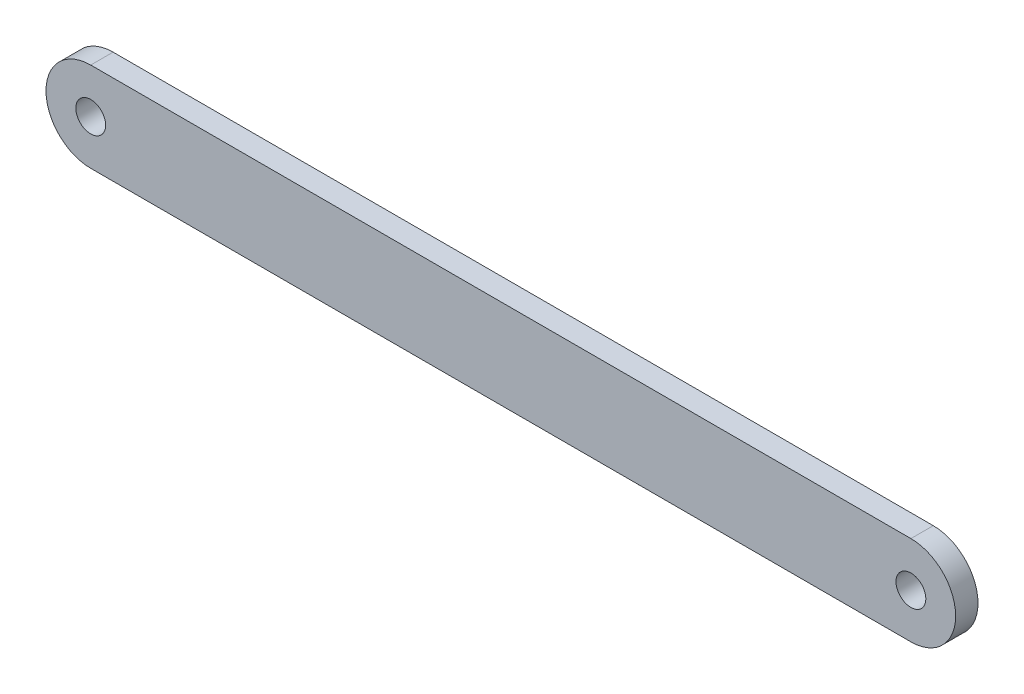
ISO-10303-21;
HEADER;
FILE_DESCRIPTION(('STEP AP214'),'2;1');
FILE_NAME('part.step','',(''),(''),'','','');
FILE_SCHEMA(('AUTOMOTIVE_DESIGN { 1 0 10303 214 1 1 1 1 }'));
ENDSEC;
DATA;
#1=APPLICATION_CONTEXT('core data for automotive mechanical design processes');
#2=APPLICATION_PROTOCOL_DEFINITION('international standard','automotive_design',2000,#1);
#3=PRODUCT_CONTEXT('',#1,'mechanical');
#4=PRODUCT('Part','Part','',(#3));
#5=PRODUCT_RELATED_PRODUCT_CATEGORY('part','',(#4));
#6=PRODUCT_DEFINITION_FORMATION('','',#4);
#7=PRODUCT_DEFINITION_CONTEXT('part definition',#1,'design');
#8=PRODUCT_DEFINITION('design','',#6,#7);
#9=PRODUCT_DEFINITION_SHAPE('','',#8);
#10=(LENGTH_UNIT() NAMED_UNIT(*) SI_UNIT(.MILLI.,.METRE.));
#11=(NAMED_UNIT(*) PLANE_ANGLE_UNIT() SI_UNIT($,.RADIAN.));
#12=(NAMED_UNIT(*) SI_UNIT($,.STERADIAN.) SOLID_ANGLE_UNIT());
#13=UNCERTAINTY_MEASURE_WITH_UNIT(LENGTH_MEASURE(1.E-05),#10,'distance_accuracy_value','');
#14=(GEOMETRIC_REPRESENTATION_CONTEXT(3) GLOBAL_UNCERTAINTY_ASSIGNED_CONTEXT((#13)) GLOBAL_UNIT_ASSIGNED_CONTEXT((#10,
#11,#12)) REPRESENTATION_CONTEXT('',''));
#15=CARTESIAN_POINT('',(0.,0.,0.));
#16=DIRECTION('',(0.,0.,1.));
#17=DIRECTION('',(1.,0.,0.));
#18=AXIS2_PLACEMENT_3D('',#15,#16,#17);
#19=CARTESIAN_POINT('',(-35.3127241673783,0.,3.));
#20=DIRECTION('',(0.,0.,1.));
#21=DIRECTION('',(1.,0.,0.));
#22=AXIS2_PLACEMENT_3D('',#19,#20,#21);
#23=PLANE('',#22);
#24=CARTESIAN_POINT('',(-35.3127241673783,0.,3.));
#25=DIRECTION('',(0.,0.,1.));
#26=DIRECTION('',(1.,0.,0.));
#27=AXIS2_PLACEMENT_3D('',#24,#25,#26);
#28=CIRCLE('',#27,2.);
#29=CARTESIAN_POINT('',(-33.3127241673783,0.,3.));
#30=VERTEX_POINT('',#29);
#31=EDGE_CURVE('E99',#30,#30,#28,.T.);
#32=ORIENTED_EDGE('',*,*,#31,.F.);
#33=EDGE_LOOP('',(#32));
#34=FACE_BOUND('',#33,.T.);
#35=CARTESIAN_POINT('',(-35.3127241673783,0.,3.));
#36=DIRECTION('',(0.,0.,1.));
#37=DIRECTION('',(1.,0.,0.));
#38=AXIS2_PLACEMENT_3D('',#35,#36,#37);
#39=CIRCLE('',#38,6.);
#40=CARTESIAN_POINT('',(-35.3127241673783,6.,3.));
#41=VERTEX_POINT('',#40);
#42=CARTESIAN_POINT('',(-35.3127241673783,-6.,3.));
#43=VERTEX_POINT('',#42);
#44=EDGE_CURVE('E84',#41,#43,#39,.T.);
#45=ORIENTED_EDGE('',*,*,#44,.T.);
#46=DIRECTION('',(1.,0.,0.));
#47=VECTOR('',#46,1.);
#48=CARTESIAN_POINT('',(-35.3127241673783,-6.,3.));
#49=LINE('',#48,#47);
#50=CARTESIAN_POINT('',(74.6872758326217,-6.,3.));
#51=VERTEX_POINT('',#50);
#52=EDGE_CURVE('E79',#43,#51,#49,.T.);
#53=ORIENTED_EDGE('',*,*,#52,.T.);
#54=CARTESIAN_POINT('',(74.6872758326217,0.,3.));
#55=DIRECTION('',(0.,0.,1.));
#56=DIRECTION('',(1.,0.,0.));
#57=AXIS2_PLACEMENT_3D('',#54,#55,#56);
#58=CIRCLE('',#57,6.);
#59=CARTESIAN_POINT('',(74.6872758326217,6.,3.));
#60=VERTEX_POINT('',#59);
#61=EDGE_CURVE('E82',#51,#60,#58,.T.);
#62=ORIENTED_EDGE('',*,*,#61,.T.);
#63=DIRECTION('',(-1.,0.,0.));
#64=VECTOR('',#63,1.);
#65=CARTESIAN_POINT('',(-35.3127241673783,6.,3.));
#66=LINE('',#65,#64);
#67=EDGE_CURVE('E49',#60,#41,#66,.T.);
#68=ORIENTED_EDGE('',*,*,#67,.T.);
#69=EDGE_LOOP('',(#45,#53,#62,#68));
#70=FACE_BOUND('',#69,.T.);
#71=CARTESIAN_POINT('',(74.6872758326217,0.,3.));
#72=DIRECTION('',(0.,0.,1.));
#73=DIRECTION('',(1.,0.,0.));
#74=AXIS2_PLACEMENT_3D('',#71,#72,#73);
#75=CIRCLE('',#74,2.);
#76=CARTESIAN_POINT('',(76.6872758326217,0.,3.));
#77=VERTEX_POINT('',#76);
#78=EDGE_CURVE('E114',#77,#77,#75,.T.);
#79=ORIENTED_EDGE('',*,*,#78,.F.);
#80=EDGE_LOOP('',(#79));
#81=FACE_BOUND('',#80,.T.);
#82=ADVANCED_FACE('F32',(#34,#70,#81),#23,.T.);
#83=CARTESIAN_POINT('',(-35.3127241673783,0.,0.));
#84=DIRECTION('',(0.,0.,1.));
#85=DIRECTION('',(1.,0.,0.));
#86=AXIS2_PLACEMENT_3D('',#83,#84,#85);
#87=PLANE('',#86);
#88=CARTESIAN_POINT('',(-35.3127241673783,0.,0.));
#89=DIRECTION('',(0.,0.,1.));
#90=DIRECTION('',(1.,0.,0.));
#91=AXIS2_PLACEMENT_3D('',#88,#89,#90);
#92=CIRCLE('',#91,2.);
#93=CARTESIAN_POINT('',(-33.3127241673783,0.,0.));
#94=VERTEX_POINT('',#93);
#95=EDGE_CURVE('E111',#94,#94,#92,.T.);
#96=ORIENTED_EDGE('',*,*,#95,.T.);
#97=EDGE_LOOP('',(#96));
#98=FACE_BOUND('',#97,.T.);
#99=CARTESIAN_POINT('',(-35.3127241673783,0.,0.));
#100=DIRECTION('',(0.,0.,1.));
#101=DIRECTION('',(1.,0.,0.));
#102=AXIS2_PLACEMENT_3D('',#99,#100,#101);
#103=CIRCLE('',#102,6.);
#104=CARTESIAN_POINT('',(-35.3127241673783,6.,0.));
#105=VERTEX_POINT('',#104);
#106=CARTESIAN_POINT('',(-35.3127241673783,-6.,0.));
#107=VERTEX_POINT('',#106);
#108=EDGE_CURVE('E96',#105,#107,#103,.T.);
#109=ORIENTED_EDGE('',*,*,#108,.F.);
#110=DIRECTION('',(-1.,0.,0.));
#111=VECTOR('',#110,1.);
#112=CARTESIAN_POINT('',(-35.3127241673783,6.,0.));
#113=LINE('',#112,#111);
#114=CARTESIAN_POINT('',(74.6872758326217,6.,0.));
#115=VERTEX_POINT('',#114);
#116=EDGE_CURVE('E72',#115,#105,#113,.T.);
#117=ORIENTED_EDGE('',*,*,#116,.F.);
#118=CARTESIAN_POINT('',(74.6872758326217,0.,0.));
#119=DIRECTION('',(0.,0.,1.));
#120=DIRECTION('',(1.,0.,0.));
#121=AXIS2_PLACEMENT_3D('',#118,#119,#120);
#122=CIRCLE('',#121,6.);
#123=CARTESIAN_POINT('',(74.6872758326217,-6.,0.));
#124=VERTEX_POINT('',#123);
#125=EDGE_CURVE('E66',#124,#115,#122,.T.);
#126=ORIENTED_EDGE('',*,*,#125,.F.);
#127=DIRECTION('',(1.,0.,0.));
#128=VECTOR('',#127,1.);
#129=CARTESIAN_POINT('',(-35.3127241673783,-6.,0.));
#130=LINE('',#129,#128);
#131=EDGE_CURVE('E88',#107,#124,#130,.T.);
#132=ORIENTED_EDGE('',*,*,#131,.F.);
#133=EDGE_LOOP('',(#109,#117,#126,#132));
#134=FACE_BOUND('',#133,.T.);
#135=CARTESIAN_POINT('',(74.6872758326217,0.,0.));
#136=DIRECTION('',(0.,0.,1.));
#137=DIRECTION('',(1.,0.,0.));
#138=AXIS2_PLACEMENT_3D('',#135,#136,#137);
#139=CIRCLE('',#138,2.);
#140=CARTESIAN_POINT('',(76.6872758326217,0.,0.));
#141=VERTEX_POINT('',#140);
#142=EDGE_CURVE('E117',#141,#141,#139,.T.);
#143=ORIENTED_EDGE('',*,*,#142,.T.);
#144=EDGE_LOOP('',(#143));
#145=FACE_BOUND('',#144,.T.);
#146=ADVANCED_FACE('F107',(#98,#134,#145),#87,.F.);
#147=CARTESIAN_POINT('',(-35.3127241673783,0.,3.));
#148=DIRECTION('',(0.,0.,-1.));
#149=DIRECTION('',(-1.,0.,0.));
#150=AXIS2_PLACEMENT_3D('',#147,#148,#149);
#151=CYLINDRICAL_SURFACE('',#150,6.);
#152=ORIENTED_EDGE('',*,*,#108,.T.);
#153=DIRECTION('',(0.,0.,-1.));
#154=VECTOR('',#153,1.);
#155=CARTESIAN_POINT('',(-35.3127241673783,-6.,3.));
#156=LINE('',#155,#154);
#157=EDGE_CURVE('E11',#43,#107,#156,.T.);
#158=ORIENTED_EDGE('',*,*,#157,.F.);
#159=ORIENTED_EDGE('',*,*,#44,.F.);
#160=DIRECTION('',(0.,0.,-1.));
#161=VECTOR('',#160,1.);
#162=CARTESIAN_POINT('',(-35.3127241673783,6.,3.));
#163=LINE('',#162,#161);
#164=EDGE_CURVE('E92',#41,#105,#163,.T.);
#165=ORIENTED_EDGE('',*,*,#164,.T.);
#166=EDGE_LOOP('',(#152,#158,#159,#165));
#167=FACE_BOUND('',#166,.T.);
#168=ADVANCED_FACE('F34',(#167),#151,.T.);
#169=CARTESIAN_POINT('',(-35.3127241673783,-6.,3.));
#170=DIRECTION('',(0.,1.,0.));
#171=DIRECTION('',(0.,0.,1.));
#172=AXIS2_PLACEMENT_3D('',#169,#170,#171);
#173=PLANE('',#172);
#174=ORIENTED_EDGE('',*,*,#131,.T.);
#175=DIRECTION('',(0.,0.,-1.));
#176=VECTOR('',#175,1.);
#177=CARTESIAN_POINT('',(74.6872758326217,-6.,3.));
#178=LINE('',#177,#176);
#179=EDGE_CURVE('E41',#51,#124,#178,.T.);
#180=ORIENTED_EDGE('',*,*,#179,.F.);
#181=ORIENTED_EDGE('',*,*,#52,.F.);
#182=ORIENTED_EDGE('',*,*,#157,.T.);
#183=EDGE_LOOP('',(#174,#180,#181,#182));
#184=FACE_BOUND('',#183,.T.);
#185=ADVANCED_FACE('F87',(#184),#173,.F.);
#186=CARTESIAN_POINT('',(74.6872758326217,0.,3.));
#187=DIRECTION('',(0.,0.,-1.));
#188=DIRECTION('',(-1.,0.,0.));
#189=AXIS2_PLACEMENT_3D('',#186,#187,#188);
#190=CYLINDRICAL_SURFACE('',#189,6.);
#191=ORIENTED_EDGE('',*,*,#125,.T.);
#192=DIRECTION('',(0.,0.,-1.));
#193=VECTOR('',#192,1.);
#194=CARTESIAN_POINT('',(74.6872758326217,6.,3.));
#195=LINE('',#194,#193);
#196=EDGE_CURVE('E89',#60,#115,#195,.T.);
#197=ORIENTED_EDGE('',*,*,#196,.F.);
#198=ORIENTED_EDGE('',*,*,#61,.F.);
#199=ORIENTED_EDGE('',*,*,#179,.T.);
#200=EDGE_LOOP('',(#191,#197,#198,#199));
#201=FACE_BOUND('',#200,.T.);
#202=ADVANCED_FACE('F90',(#201),#190,.T.);
#203=CARTESIAN_POINT('',(-35.3127241673783,6.,3.));
#204=DIRECTION('',(0.,-1.,0.));
#205=DIRECTION('',(0.,0.,-1.));
#206=AXIS2_PLACEMENT_3D('',#203,#204,#205);
#207=PLANE('',#206);
#208=ORIENTED_EDGE('',*,*,#116,.T.);
#209=ORIENTED_EDGE('',*,*,#164,.F.);
#210=ORIENTED_EDGE('',*,*,#67,.F.);
#211=ORIENTED_EDGE('',*,*,#196,.T.);
#212=EDGE_LOOP('',(#208,#209,#210,#211));
#213=FACE_BOUND('',#212,.T.);
#214=ADVANCED_FACE('F104',(#213),#207,.F.);
#215=CARTESIAN_POINT('',(-35.3127241673783,0.,3.));
#216=DIRECTION('',(0.,0.,-1.));
#217=DIRECTION('',(-1.,0.,0.));
#218=AXIS2_PLACEMENT_3D('',#215,#216,#217);
#219=CYLINDRICAL_SURFACE('',#218,2.);
#220=ORIENTED_EDGE('',*,*,#31,.T.);
#221=EDGE_LOOP('',(#220));
#222=FACE_BOUND('',#221,.T.);
#223=ORIENTED_EDGE('',*,*,#95,.F.);
#224=EDGE_LOOP('',(#223));
#225=FACE_BOUND('',#224,.T.);
#226=ADVANCED_FACE('F135',(#222,#225),#219,.F.);
#227=CARTESIAN_POINT('',(74.6872758326217,0.,3.));
#228=DIRECTION('',(0.,0.,-1.));
#229=DIRECTION('',(-1.,0.,0.));
#230=AXIS2_PLACEMENT_3D('',#227,#228,#229);
#231=CYLINDRICAL_SURFACE('',#230,2.);
#232=ORIENTED_EDGE('',*,*,#78,.T.);
#233=EDGE_LOOP('',(#232));
#234=FACE_BOUND('',#233,.T.);
#235=ORIENTED_EDGE('',*,*,#142,.F.);
#236=EDGE_LOOP('',(#235));
#237=FACE_BOUND('',#236,.T.);
#238=ADVANCED_FACE('F123',(#234,#237),#231,.F.);
#239=CLOSED_SHELL('',(#82,#146,#168,#185,#202,#214,#226,#238));
#240=MANIFOLD_SOLID_BREP('B2',#239);
#241=ADVANCED_BREP_SHAPE_REPRESENTATION('',(#18,#240),#14);
#242=SHAPE_DEFINITION_REPRESENTATION(#9,#241);
ENDSEC;
END-ISO-10303-21;
